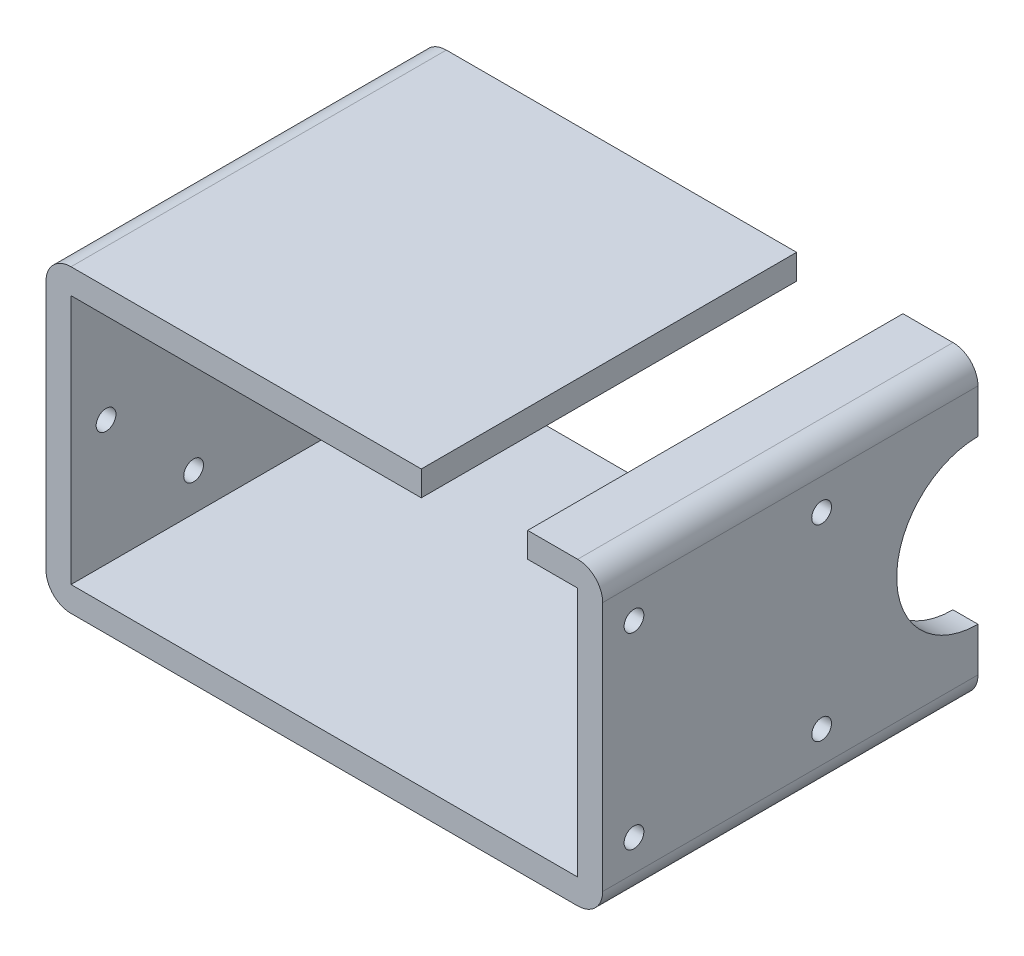
ISO-10303-21;
HEADER;
FILE_DESCRIPTION(('STEP AP214'),'2;1');
FILE_NAME('part.step','',(''),(''),'','','');
FILE_SCHEMA(('AUTOMOTIVE_DESIGN { 1 0 10303 214 1 1 1 1 }'));
ENDSEC;
DATA;
#1=APPLICATION_CONTEXT('core data for automotive mechanical design processes');
#2=APPLICATION_PROTOCOL_DEFINITION('international standard','automotive_design',2000,#1);
#3=PRODUCT_CONTEXT('',#1,'mechanical');
#4=PRODUCT('Part','Part','',(#3));
#5=PRODUCT_RELATED_PRODUCT_CATEGORY('part','',(#4));
#6=PRODUCT_DEFINITION_FORMATION('','',#4);
#7=PRODUCT_DEFINITION_CONTEXT('part definition',#1,'design');
#8=PRODUCT_DEFINITION('design','',#6,#7);
#9=PRODUCT_DEFINITION_SHAPE('','',#8);
#10=(LENGTH_UNIT() NAMED_UNIT(*) SI_UNIT(.MILLI.,.METRE.));
#11=(NAMED_UNIT(*) PLANE_ANGLE_UNIT() SI_UNIT($,.RADIAN.));
#12=(NAMED_UNIT(*) SI_UNIT($,.STERADIAN.) SOLID_ANGLE_UNIT());
#13=UNCERTAINTY_MEASURE_WITH_UNIT(LENGTH_MEASURE(1.E-05),#10,'distance_accuracy_value','');
#14=(GEOMETRIC_REPRESENTATION_CONTEXT(3) GLOBAL_UNCERTAINTY_ASSIGNED_CONTEXT((#13)) GLOBAL_UNIT_ASSIGNED_CONTEXT((#10,
#11,#12)) REPRESENTATION_CONTEXT('',''));
#15=CARTESIAN_POINT('',(0.,0.,0.));
#16=DIRECTION('',(0.,0.,1.));
#17=DIRECTION('',(1.,0.,0.));
#18=AXIS2_PLACEMENT_3D('',#15,#16,#17);
#19=CARTESIAN_POINT('',(42.5,22.,-30.));
#20=DIRECTION('',(0.,1.,0.));
#21=DIRECTION('',(0.,0.,1.));
#22=AXIS2_PLACEMENT_3D('',#19,#20,#21);
#23=PLANE('',#22);
#24=DIRECTION('',(0.,0.,1.));
#25=VECTOR('',#24,1.);
#26=CARTESIAN_POINT('',(36.5,22.,-30.));
#27=LINE('',#26,#25);
#28=CARTESIAN_POINT('',(36.5,22.,-30.));
#29=VERTEX_POINT('',#28);
#30=CARTESIAN_POINT('',(36.5,22.,0.));
#31=VERTEX_POINT('',#30);
#32=EDGE_CURVE('E181',#29,#31,#27,.T.);
#33=ORIENTED_EDGE('',*,*,#32,.T.);
#34=DIRECTION('',(-1.,0.,0.));
#35=VECTOR('',#34,1.);
#36=CARTESIAN_POINT('',(42.5,22.,0.));
#37=LINE('',#36,#35);
#38=CARTESIAN_POINT('',(40.5,22.,0.));
#39=VERTEX_POINT('',#38);
#40=EDGE_CURVE('E183',#39,#31,#37,.T.);
#41=ORIENTED_EDGE('',*,*,#40,.F.);
#42=DIRECTION('',(0.,0.,1.));
#43=VECTOR('',#42,1.);
#44=CARTESIAN_POINT('',(40.5,22.,-30.));
#45=LINE('',#44,#43);
#46=CARTESIAN_POINT('',(40.5,22.,-30.));
#47=VERTEX_POINT('',#46);
#48=EDGE_CURVE('E243',#39,#47,#45,.F.);
#49=ORIENTED_EDGE('',*,*,#48,.T.);
#50=DIRECTION('',(-1.,0.,0.));
#51=VECTOR('',#50,1.);
#52=CARTESIAN_POINT('',(42.5,22.,-30.));
#53=LINE('',#52,#51);
#54=EDGE_CURVE('E186',#47,#29,#53,.T.);
#55=ORIENTED_EDGE('',*,*,#54,.T.);
#56=EDGE_LOOP('',(#33,#41,#49,#55));
#57=FACE_BOUND('',#56,.T.);
#58=ADVANCED_FACE('F17',(#57),#23,.T.);
#59=CARTESIAN_POINT('',(40.5,20.,-30.));
#60=DIRECTION('',(0.,1.,0.));
#61=DIRECTION('',(0.,0.,1.));
#62=AXIS2_PLACEMENT_3D('',#59,#60,#61);
#63=PLANE('',#62);
#64=DIRECTION('',(-1.,0.,0.));
#65=VECTOR('',#64,1.);
#66=CARTESIAN_POINT('',(40.5,20.,0.));
#67=LINE('',#66,#65);
#68=CARTESIAN_POINT('',(40.5,20.,0.));
#69=VERTEX_POINT('',#68);
#70=CARTESIAN_POINT('',(36.5,20.,0.));
#71=VERTEX_POINT('',#70);
#72=EDGE_CURVE('E227',#69,#71,#67,.T.);
#73=ORIENTED_EDGE('',*,*,#72,.T.);
#74=DIRECTION('',(0.,0.,1.));
#75=VECTOR('',#74,1.);
#76=CARTESIAN_POINT('',(36.5,20.,-30.));
#77=LINE('',#76,#75);
#78=CARTESIAN_POINT('',(36.5,20.,-30.));
#79=VERTEX_POINT('',#78);
#80=EDGE_CURVE('E33',#79,#71,#77,.T.);
#81=ORIENTED_EDGE('',*,*,#80,.F.);
#82=DIRECTION('',(-1.,0.,0.));
#83=VECTOR('',#82,1.);
#84=CARTESIAN_POINT('',(40.5,20.,-30.));
#85=LINE('',#84,#83);
#86=CARTESIAN_POINT('',(40.5,20.,-30.));
#87=VERTEX_POINT('',#86);
#88=EDGE_CURVE('E287',#87,#79,#85,.T.);
#89=ORIENTED_EDGE('',*,*,#88,.F.);
#90=DIRECTION('',(0.,0.,1.));
#91=VECTOR('',#90,1.);
#92=CARTESIAN_POINT('',(40.5,20.,-30.));
#93=LINE('',#92,#91);
#94=EDGE_CURVE('E229',#87,#69,#93,.T.);
#95=ORIENTED_EDGE('',*,*,#94,.T.);
#96=EDGE_LOOP('',(#73,#81,#89,#95));
#97=FACE_BOUND('',#96,.T.);
#98=ADVANCED_FACE('F633',(#97),#63,.F.);
#99=CARTESIAN_POINT('',(28.,22.,0.));
#100=VERTEX_POINT('',#99);
#101=CARTESIAN_POINT('',(0.,22.,0.));
#102=VERTEX_POINT('',#101);
#103=EDGE_CURVE('E204',#100,#102,#37,.T.);
#104=ORIENTED_EDGE('',*,*,#103,.F.);
#105=DIRECTION('',(0.,0.,-1.));
#106=VECTOR('',#105,1.);
#107=CARTESIAN_POINT('',(28.,22.,-18.5));
#108=LINE('',#107,#106);
#109=CARTESIAN_POINT('',(28.,22.,-30.));
#110=VERTEX_POINT('',#109);
#111=EDGE_CURVE('E190',#100,#110,#108,.T.);
#112=ORIENTED_EDGE('',*,*,#111,.T.);
#113=CARTESIAN_POINT('',(0.,22.,-30.));
#114=VERTEX_POINT('',#113);
#115=EDGE_CURVE('E266',#110,#114,#53,.T.);
#116=ORIENTED_EDGE('',*,*,#115,.T.);
#117=DIRECTION('',(0.,0.,1.));
#118=VECTOR('',#117,1.);
#119=CARTESIAN_POINT('',(0.,22.,-30.));
#120=LINE('',#119,#118);
#121=EDGE_CURVE('E434',#114,#102,#120,.T.);
#122=ORIENTED_EDGE('',*,*,#121,.T.);
#123=EDGE_LOOP('',(#104,#112,#116,#122));
#124=FACE_BOUND('',#123,.T.);
#125=ADVANCED_FACE('F635',(#124),#23,.T.);
#126=CARTESIAN_POINT('',(0.,0.,-30.));
#127=DIRECTION('',(0.,0.,1.));
#128=DIRECTION('',(1.,0.,0.));
#129=AXIS2_PLACEMENT_3D('',#126,#127,#128);
#130=PLANE('',#129);
#131=DIRECTION('',(0.,1.,0.));
#132=VECTOR('',#131,1.);
#133=CARTESIAN_POINT('',(28.,-2.2,-30.));
#134=LINE('',#133,#132);
#135=CARTESIAN_POINT('',(28.,-2.,-30.));
#136=VERTEX_POINT('',#135);
#137=CARTESIAN_POINT('',(28.,0.,-30.));
#138=VERTEX_POINT('',#137);
#139=EDGE_CURVE('E409',#136,#138,#134,.T.);
#140=ORIENTED_EDGE('',*,*,#139,.F.);
#141=DIRECTION('',(1.,0.,0.));
#142=VECTOR('',#141,1.);
#143=CARTESIAN_POINT('',(-2.,-2.,-30.));
#144=LINE('',#143,#142);
#145=CARTESIAN_POINT('',(0.,-2.,-30.));
#146=VERTEX_POINT('',#145);
#147=EDGE_CURVE('E250',#146,#136,#144,.T.);
#148=ORIENTED_EDGE('',*,*,#147,.F.);
#149=CARTESIAN_POINT('',(0.,0.,-30.));
#150=DIRECTION('',(0.,0.,1.));
#151=DIRECTION('',(1.,0.,0.));
#152=AXIS2_PLACEMENT_3D('',#149,#150,#151);
#153=CIRCLE('',#152,2.);
#154=CARTESIAN_POINT('',(-2.,0.,-30.));
#155=VERTEX_POINT('',#154);
#156=EDGE_CURVE('E273',#146,#155,#153,.F.);
#157=ORIENTED_EDGE('',*,*,#156,.T.);
#158=DIRECTION('',(0.,-1.,0.));
#159=VECTOR('',#158,1.);
#160=CARTESIAN_POINT('',(-2.,22.,-30.));
#161=LINE('',#160,#159);
#162=CARTESIAN_POINT('',(-2.,3.5,-30.));
#163=VERTEX_POINT('',#162);
#164=EDGE_CURVE('E222',#163,#155,#161,.T.);
#165=ORIENTED_EDGE('',*,*,#164,.F.);
#166=DIRECTION('',(1.,0.,0.));
#167=VECTOR('',#166,1.);
#168=CARTESIAN_POINT('',(-2.,3.5,-30.));
#169=LINE('',#168,#167);
#170=CARTESIAN_POINT('',(0.,3.5,-30.));
#171=VERTEX_POINT('',#170);
#172=EDGE_CURVE('E353',#171,#163,#169,.F.);
#173=ORIENTED_EDGE('',*,*,#172,.F.);
#174=DIRECTION('',(0.,-1.,0.));
#175=VECTOR('',#174,1.);
#176=CARTESIAN_POINT('',(0.,20.,-30.));
#177=LINE('',#176,#175);
#178=CARTESIAN_POINT('',(0.,0.,-30.));
#179=VERTEX_POINT('',#178);
#180=EDGE_CURVE('E284',#171,#179,#177,.T.);
#181=ORIENTED_EDGE('',*,*,#180,.T.);
#182=DIRECTION('',(1.,0.,0.));
#183=VECTOR('',#182,1.);
#184=CARTESIAN_POINT('',(0.,0.,-30.));
#185=LINE('',#184,#183);
#186=EDGE_CURVE('E239',#179,#138,#185,.T.);
#187=ORIENTED_EDGE('',*,*,#186,.T.);
#188=EDGE_LOOP('',(#140,#148,#157,#165,#173,#181,#187));
#189=FACE_BOUND('',#188,.T.);
#190=ADVANCED_FACE('F405',(#189),#130,.F.);
#191=CARTESIAN_POINT('',(-2.,-2.,-30.));
#192=DIRECTION('',(0.,-1.,0.));
#193=DIRECTION('',(0.,0.,-1.));
#194=AXIS2_PLACEMENT_3D('',#191,#192,#193);
#195=PLANE('',#194);
#196=ORIENTED_EDGE('',*,*,#147,.T.);
#197=DIRECTION('',(0.,0.,1.));
#198=VECTOR('',#197,1.);
#199=CARTESIAN_POINT('',(28.,-2.,-30.));
#200=LINE('',#199,#198);
#201=CARTESIAN_POINT('',(28.,-2.,-18.5));
#202=VERTEX_POINT('',#201);
#203=EDGE_CURVE('E547',#136,#202,#200,.T.);
#204=ORIENTED_EDGE('',*,*,#203,.T.);
#205=DIRECTION('',(1.,0.,0.));
#206=VECTOR('',#205,1.);
#207=CARTESIAN_POINT('',(28.,-2.,-18.5));
#208=LINE('',#207,#206);
#209=CARTESIAN_POINT('',(36.5,-2.,-18.5));
#210=VERTEX_POINT('',#209);
#211=EDGE_CURVE('E550',#202,#210,#208,.T.);
#212=ORIENTED_EDGE('',*,*,#211,.T.);
#213=DIRECTION('',(0.,0.,-1.));
#214=VECTOR('',#213,1.);
#215=CARTESIAN_POINT('',(36.5,-2.,-18.5));
#216=LINE('',#215,#214);
#217=CARTESIAN_POINT('',(36.5,-2.,-30.));
#218=VERTEX_POINT('',#217);
#219=EDGE_CURVE('E544',#210,#218,#216,.T.);
#220=ORIENTED_EDGE('',*,*,#219,.T.);
#221=CARTESIAN_POINT('',(40.5,-2.,-30.));
#222=VERTEX_POINT('',#221);
#223=EDGE_CURVE('E332',#218,#222,#144,.T.);
#224=ORIENTED_EDGE('',*,*,#223,.T.);
#225=DIRECTION('',(0.,0.,1.));
#226=VECTOR('',#225,1.);
#227=CARTESIAN_POINT('',(40.5,-2.,-30.));
#228=LINE('',#227,#226);
#229=CARTESIAN_POINT('',(40.5,-2.,0.));
#230=VERTEX_POINT('',#229);
#231=EDGE_CURVE('E327',#222,#230,#228,.T.);
#232=ORIENTED_EDGE('',*,*,#231,.T.);
#233=DIRECTION('',(1.,0.,0.));
#234=VECTOR('',#233,1.);
#235=CARTESIAN_POINT('',(-2.,-2.,0.));
#236=LINE('',#235,#234);
#237=CARTESIAN_POINT('',(0.,-2.,0.));
#238=VERTEX_POINT('',#237);
#239=EDGE_CURVE('E303',#238,#230,#236,.T.);
#240=ORIENTED_EDGE('',*,*,#239,.F.);
#241=DIRECTION('',(0.,0.,1.));
#242=VECTOR('',#241,1.);
#243=CARTESIAN_POINT('',(0.,-2.,-30.));
#244=LINE('',#243,#242);
#245=EDGE_CURVE('E267',#238,#146,#244,.F.);
#246=ORIENTED_EDGE('',*,*,#245,.T.);
#247=EDGE_LOOP('',(#196,#204,#212,#220,#224,#232,#240,#246));
#248=FACE_BOUND('',#247,.T.);
#249=ADVANCED_FACE('F399',(#248),#195,.T.);
#250=CARTESIAN_POINT('',(0.,0.,-30.));
#251=DIRECTION('',(0.,-1.,0.));
#252=DIRECTION('',(0.,0.,-1.));
#253=AXIS2_PLACEMENT_3D('',#250,#251,#252);
#254=PLANE('',#253);
#255=DIRECTION('',(0.,0.,1.));
#256=VECTOR('',#255,1.);
#257=CARTESIAN_POINT('',(28.,0.,-30.));
#258=LINE('',#257,#256);
#259=CARTESIAN_POINT('',(28.,0.,-18.5));
#260=VERTEX_POINT('',#259);
#261=EDGE_CURVE('E524',#138,#260,#258,.T.);
#262=ORIENTED_EDGE('',*,*,#261,.F.);
#263=ORIENTED_EDGE('',*,*,#186,.F.);
#264=DIRECTION('',(0.,0.,1.));
#265=VECTOR('',#264,1.);
#266=CARTESIAN_POINT('',(0.,0.,-30.));
#267=LINE('',#266,#265);
#268=CARTESIAN_POINT('',(0.,0.,0.));
#269=VERTEX_POINT('',#268);
#270=EDGE_CURVE('E236',#179,#269,#267,.T.);
#271=ORIENTED_EDGE('',*,*,#270,.T.);
#272=DIRECTION('',(1.,0.,0.));
#273=VECTOR('',#272,1.);
#274=CARTESIAN_POINT('',(0.,0.,0.));
#275=LINE('',#274,#273);
#276=CARTESIAN_POINT('',(40.5,0.,0.));
#277=VERTEX_POINT('',#276);
#278=EDGE_CURVE('E218',#269,#277,#275,.T.);
#279=ORIENTED_EDGE('',*,*,#278,.T.);
#280=DIRECTION('',(0.,0.,1.));
#281=VECTOR('',#280,1.);
#282=CARTESIAN_POINT('',(40.5,0.,-30.));
#283=LINE('',#282,#281);
#284=CARTESIAN_POINT('',(40.5,0.,-30.));
#285=VERTEX_POINT('',#284);
#286=EDGE_CURVE('E233',#285,#277,#283,.T.);
#287=ORIENTED_EDGE('',*,*,#286,.F.);
#288=CARTESIAN_POINT('',(36.5,0.,-30.));
#289=VERTEX_POINT('',#288);
#290=EDGE_CURVE('E592',#289,#285,#185,.T.);
#291=ORIENTED_EDGE('',*,*,#290,.F.);
#292=DIRECTION('',(0.,0.,-1.));
#293=VECTOR('',#292,1.);
#294=CARTESIAN_POINT('',(36.5,0.,-18.5));
#295=LINE('',#294,#293);
#296=CARTESIAN_POINT('',(36.5,0.,-18.5));
#297=VERTEX_POINT('',#296);
#298=EDGE_CURVE('E542',#297,#289,#295,.T.);
#299=ORIENTED_EDGE('',*,*,#298,.F.);
#300=DIRECTION('',(1.,0.,0.));
#301=VECTOR('',#300,1.);
#302=CARTESIAN_POINT('',(28.,0.,-18.5));
#303=LINE('',#302,#301);
#304=EDGE_CURVE('E41',#260,#297,#303,.T.);
#305=ORIENTED_EDGE('',*,*,#304,.F.);
#306=EDGE_LOOP('',(#262,#263,#271,#279,#287,#291,#299,#305));
#307=FACE_BOUND('',#306,.T.);
#308=ADVANCED_FACE('F590',(#307),#254,.F.);
#309=DIRECTION('',(0.,-1.,0.));
#310=VECTOR('',#309,1.);
#311=CARTESIAN_POINT('',(36.5,22.,-30.));
#312=LINE('',#311,#310);
#313=EDGE_CURVE('E189',#29,#79,#312,.T.);
#314=ORIENTED_EDGE('',*,*,#313,.F.);
#315=ORIENTED_EDGE('',*,*,#54,.F.);
#316=CARTESIAN_POINT('',(40.5,20.,-30.));
#317=DIRECTION('',(0.,0.,1.));
#318=DIRECTION('',(1.,0.,0.));
#319=AXIS2_PLACEMENT_3D('',#316,#317,#318);
#320=CIRCLE('',#319,2.);
#321=CARTESIAN_POINT('',(42.5,20.,-30.));
#322=VERTEX_POINT('',#321);
#323=EDGE_CURVE('E384',#47,#322,#320,.F.);
#324=ORIENTED_EDGE('',*,*,#323,.T.);
#325=DIRECTION('',(0.,1.,0.));
#326=VECTOR('',#325,1.);
#327=CARTESIAN_POINT('',(42.5,-2.,-30.));
#328=LINE('',#327,#326);
#329=CARTESIAN_POINT('',(42.5,16.5,-30.));
#330=VERTEX_POINT('',#329);
#331=EDGE_CURVE('E244',#330,#322,#328,.T.);
#332=ORIENTED_EDGE('',*,*,#331,.F.);
#333=DIRECTION('',(1.,0.,0.));
#334=VECTOR('',#333,1.);
#335=CARTESIAN_POINT('',(40.5,16.5,-30.));
#336=LINE('',#335,#334);
#337=CARTESIAN_POINT('',(40.5,16.5,-30.));
#338=VERTEX_POINT('',#337);
#339=EDGE_CURVE('E343',#330,#338,#336,.F.);
#340=ORIENTED_EDGE('',*,*,#339,.T.);
#341=DIRECTION('',(0.,1.,0.));
#342=VECTOR('',#341,1.);
#343=CARTESIAN_POINT('',(40.5,0.,-30.));
#344=LINE('',#343,#342);
#345=EDGE_CURVE('E292',#338,#87,#344,.T.);
#346=ORIENTED_EDGE('',*,*,#345,.T.);
#347=ORIENTED_EDGE('',*,*,#88,.T.);
#348=EDGE_LOOP('',(#314,#315,#324,#332,#340,#346,#347));
#349=FACE_BOUND('',#348,.T.);
#350=ADVANCED_FACE('F650',(#349),#130,.F.);
#351=DIRECTION('',(0.,0.,-1.));
#352=VECTOR('',#351,1.);
#353=CARTESIAN_POINT('',(28.,20.,-18.5));
#354=LINE('',#353,#352);
#355=CARTESIAN_POINT('',(28.,20.,0.));
#356=VERTEX_POINT('',#355);
#357=CARTESIAN_POINT('',(28.,20.,-30.));
#358=VERTEX_POINT('',#357);
#359=EDGE_CURVE('E521',#356,#358,#354,.T.);
#360=ORIENTED_EDGE('',*,*,#359,.F.);
#361=CARTESIAN_POINT('',(0.,20.,0.));
#362=VERTEX_POINT('',#361);
#363=EDGE_CURVE('E211',#356,#362,#67,.T.);
#364=ORIENTED_EDGE('',*,*,#363,.T.);
#365=DIRECTION('',(0.,0.,1.));
#366=VECTOR('',#365,1.);
#367=CARTESIAN_POINT('',(0.,20.,-30.));
#368=LINE('',#367,#366);
#369=CARTESIAN_POINT('',(0.,20.,-30.));
#370=VERTEX_POINT('',#369);
#371=EDGE_CURVE('E232',#370,#362,#368,.T.);
#372=ORIENTED_EDGE('',*,*,#371,.F.);
#373=EDGE_CURVE('E293',#358,#370,#85,.T.);
#374=ORIENTED_EDGE('',*,*,#373,.F.);
#375=EDGE_LOOP('',(#360,#364,#372,#374));
#376=FACE_BOUND('',#375,.T.);
#377=ADVANCED_FACE('F641',(#376),#63,.F.);
#378=CARTESIAN_POINT('',(40.5,0.,-30.));
#379=DIRECTION('',(1.,0.,0.));
#380=DIRECTION('',(0.,0.,-1.));
#381=AXIS2_PLACEMENT_3D('',#378,#379,#380);
#382=PLANE('',#381);
#383=CARTESIAN_POINT('',(40.5,2.5,-2.5));
#384=DIRECTION('',(-1.,0.,0.));
#385=DIRECTION('',(0.,-1.,0.));
#386=AXIS2_PLACEMENT_3D('',#383,#384,#385);
#387=CIRCLE('',#386,0.79);
#388=CARTESIAN_POINT('',(40.5,1.71,-2.5));
#389=VERTEX_POINT('',#388);
#390=EDGE_CURVE('E468',#389,#389,#387,.T.);
#391=ORIENTED_EDGE('',*,*,#390,.F.);
#392=EDGE_LOOP('',(#391));
#393=FACE_BOUND('',#392,.T.);
#394=CARTESIAN_POINT('',(40.5,17.5,-17.5));
#395=DIRECTION('',(-1.,0.,0.));
#396=DIRECTION('',(0.,-1.,0.));
#397=AXIS2_PLACEMENT_3D('',#394,#395,#396);
#398=CIRCLE('',#397,0.79);
#399=CARTESIAN_POINT('',(40.5,16.71,-17.5));
#400=VERTEX_POINT('',#399);
#401=EDGE_CURVE('E459',#400,#400,#398,.T.);
#402=ORIENTED_EDGE('',*,*,#401,.F.);
#403=EDGE_LOOP('',(#402));
#404=FACE_BOUND('',#403,.T.);
#405=ORIENTED_EDGE('',*,*,#345,.F.);
#406=CARTESIAN_POINT('',(40.5,10.,-30.));
#407=DIRECTION('',(1.,0.,0.));
#408=DIRECTION('',(0.,-1.,0.));
#409=AXIS2_PLACEMENT_3D('',#406,#407,#408);
#410=CIRCLE('',#409,6.5);
#411=CARTESIAN_POINT('',(40.5,3.5,-30.));
#412=VERTEX_POINT('',#411);
#413=EDGE_CURVE('E345',#338,#412,#410,.T.);
#414=ORIENTED_EDGE('',*,*,#413,.T.);
#415=EDGE_CURVE('E251',#285,#412,#344,.T.);
#416=ORIENTED_EDGE('',*,*,#415,.F.);
#417=ORIENTED_EDGE('',*,*,#286,.T.);
#418=DIRECTION('',(0.,1.,0.));
#419=VECTOR('',#418,1.);
#420=CARTESIAN_POINT('',(40.5,0.,0.));
#421=LINE('',#420,#419);
#422=EDGE_CURVE('E223',#277,#69,#421,.T.);
#423=ORIENTED_EDGE('',*,*,#422,.T.);
#424=ORIENTED_EDGE('',*,*,#94,.F.);
#425=EDGE_LOOP('',(#405,#414,#416,#417,#423,#424));
#426=FACE_BOUND('',#425,.T.);
#427=CARTESIAN_POINT('',(40.5,2.5,-17.5));
#428=DIRECTION('',(-1.,0.,0.));
#429=DIRECTION('',(0.,-1.,0.));
#430=AXIS2_PLACEMENT_3D('',#427,#428,#429);
#431=CIRCLE('',#430,0.79);
#432=CARTESIAN_POINT('',(40.5,1.71,-17.5));
#433=VERTEX_POINT('',#432);
#434=EDGE_CURVE('E460',#433,#433,#431,.T.);
#435=ORIENTED_EDGE('',*,*,#434,.F.);
#436=EDGE_LOOP('',(#435));
#437=FACE_BOUND('',#436,.T.);
#438=CARTESIAN_POINT('',(40.5,17.5,-2.5));
#439=DIRECTION('',(-1.,0.,0.));
#440=DIRECTION('',(0.,-1.,0.));
#441=AXIS2_PLACEMENT_3D('',#438,#439,#440);
#442=CIRCLE('',#441,0.79);
#443=CARTESIAN_POINT('',(40.5,16.71,-2.5));
#444=VERTEX_POINT('',#443);
#445=EDGE_CURVE('E476',#444,#444,#442,.T.);
#446=ORIENTED_EDGE('',*,*,#445,.F.);
#447=EDGE_LOOP('',(#446));
#448=FACE_BOUND('',#447,.T.);
#449=ADVANCED_FACE('F677',(#393,#404,#426,#437,#448),#382,.F.);
#450=CARTESIAN_POINT('',(42.5,-2.,-30.));
#451=DIRECTION('',(1.,0.,0.));
#452=DIRECTION('',(0.,0.,-1.));
#453=AXIS2_PLACEMENT_3D('',#450,#451,#452);
#454=PLANE('',#453);
#455=CARTESIAN_POINT('',(42.5,2.5,-2.5));
#456=DIRECTION('',(-1.,0.,0.));
#457=DIRECTION('',(0.,-1.,0.));
#458=AXIS2_PLACEMENT_3D('',#455,#456,#457);
#459=CIRCLE('',#458,0.79);
#460=CARTESIAN_POINT('',(42.5,1.71,-2.5));
#461=VERTEX_POINT('',#460);
#462=EDGE_CURVE('E472',#461,#461,#459,.T.);
#463=ORIENTED_EDGE('',*,*,#462,.T.);
#464=EDGE_LOOP('',(#463));
#465=FACE_BOUND('',#464,.T.);
#466=CARTESIAN_POINT('',(42.5,17.5,-17.5));
#467=DIRECTION('',(-1.,0.,0.));
#468=DIRECTION('',(0.,-1.,0.));
#469=AXIS2_PLACEMENT_3D('',#466,#467,#468);
#470=CIRCLE('',#469,0.79);
#471=CARTESIAN_POINT('',(42.5,16.71,-17.5));
#472=VERTEX_POINT('',#471);
#473=EDGE_CURVE('E455',#472,#472,#470,.T.);
#474=ORIENTED_EDGE('',*,*,#473,.T.);
#475=EDGE_LOOP('',(#474));
#476=FACE_BOUND('',#475,.T.);
#477=DIRECTION('',(0.,1.,0.));
#478=VECTOR('',#477,1.);
#479=CARTESIAN_POINT('',(42.5,-2.,0.));
#480=LINE('',#479,#478);
#481=CARTESIAN_POINT('',(42.5,0.,0.));
#482=VERTEX_POINT('',#481);
#483=CARTESIAN_POINT('',(42.5,20.,0.));
#484=VERTEX_POINT('',#483);
#485=EDGE_CURVE('E214',#482,#484,#480,.T.);
#486=ORIENTED_EDGE('',*,*,#485,.F.);
#487=DIRECTION('',(0.,0.,1.));
#488=VECTOR('',#487,1.);
#489=CARTESIAN_POINT('',(42.5,0.,-30.));
#490=LINE('',#489,#488);
#491=CARTESIAN_POINT('',(42.5,0.,-30.));
#492=VERTEX_POINT('',#491);
#493=EDGE_CURVE('E197',#482,#492,#490,.F.);
#494=ORIENTED_EDGE('',*,*,#493,.T.);
#495=CARTESIAN_POINT('',(42.5,3.5,-30.));
#496=VERTEX_POINT('',#495);
#497=EDGE_CURVE('E249',#492,#496,#328,.T.);
#498=ORIENTED_EDGE('',*,*,#497,.T.);
#499=CARTESIAN_POINT('',(42.5,10.,-30.));
#500=DIRECTION('',(1.,0.,0.));
#501=DIRECTION('',(0.,-1.,0.));
#502=AXIS2_PLACEMENT_3D('',#499,#500,#501);
#503=CIRCLE('',#502,6.5);
#504=EDGE_CURVE('E337',#330,#496,#503,.T.);
#505=ORIENTED_EDGE('',*,*,#504,.F.);
#506=ORIENTED_EDGE('',*,*,#331,.T.);
#507=DIRECTION('',(0.,0.,1.));
#508=VECTOR('',#507,1.);
#509=CARTESIAN_POINT('',(42.5,20.,-30.));
#510=LINE('',#509,#508);
#511=EDGE_CURVE('E276',#322,#484,#510,.T.);
#512=ORIENTED_EDGE('',*,*,#511,.T.);
#513=EDGE_LOOP('',(#486,#494,#498,#505,#506,#512));
#514=FACE_BOUND('',#513,.T.);
#515=CARTESIAN_POINT('',(42.5,2.5,-17.5));
#516=DIRECTION('',(-1.,0.,0.));
#517=DIRECTION('',(0.,-1.,0.));
#518=AXIS2_PLACEMENT_3D('',#515,#516,#517);
#519=CIRCLE('',#518,0.79);
#520=CARTESIAN_POINT('',(42.5,1.71,-17.5));
#521=VERTEX_POINT('',#520);
#522=EDGE_CURVE('E464',#521,#521,#519,.T.);
#523=ORIENTED_EDGE('',*,*,#522,.T.);
#524=EDGE_LOOP('',(#523));
#525=FACE_BOUND('',#524,.T.);
#526=CARTESIAN_POINT('',(42.5,17.5,-2.5));
#527=DIRECTION('',(-1.,0.,0.));
#528=DIRECTION('',(0.,-1.,0.));
#529=AXIS2_PLACEMENT_3D('',#526,#527,#528);
#530=CIRCLE('',#529,0.79);
#531=CARTESIAN_POINT('',(42.5,16.71,-2.5));
#532=VERTEX_POINT('',#531);
#533=EDGE_CURVE('E480',#532,#532,#530,.T.);
#534=ORIENTED_EDGE('',*,*,#533,.T.);
#535=EDGE_LOOP('',(#534));
#536=FACE_BOUND('',#535,.T.);
#537=ADVANCED_FACE('F318',(#465,#476,#514,#525,#536),#454,.T.);
#538=ORIENTED_EDGE('',*,*,#223,.F.);
#539=DIRECTION('',(0.,1.,0.));
#540=VECTOR('',#539,1.);
#541=CARTESIAN_POINT('',(36.5,-2.2,-30.));
#542=LINE('',#541,#540);
#543=EDGE_CURVE('E543',#218,#289,#542,.T.);
#544=ORIENTED_EDGE('',*,*,#543,.T.);
#545=ORIENTED_EDGE('',*,*,#290,.T.);
#546=ORIENTED_EDGE('',*,*,#415,.T.);
#547=DIRECTION('',(1.,0.,0.));
#548=VECTOR('',#547,1.);
#549=CARTESIAN_POINT('',(40.5,3.5,-30.));
#550=LINE('',#549,#548);
#551=EDGE_CURVE('E304',#412,#496,#550,.T.);
#552=ORIENTED_EDGE('',*,*,#551,.T.);
#553=ORIENTED_EDGE('',*,*,#497,.F.);
#554=CARTESIAN_POINT('',(40.5,0.,-30.));
#555=DIRECTION('',(0.,0.,1.));
#556=DIRECTION('',(1.,0.,0.));
#557=AXIS2_PLACEMENT_3D('',#554,#555,#556);
#558=CIRCLE('',#557,2.);
#559=EDGE_CURVE('E269',#492,#222,#558,.F.);
#560=ORIENTED_EDGE('',*,*,#559,.T.);
#561=EDGE_LOOP('',(#538,#544,#545,#546,#552,#553,#560));
#562=FACE_BOUND('',#561,.T.);
#563=ADVANCED_FACE('F330',(#562),#130,.F.);
#564=ORIENTED_EDGE('',*,*,#115,.F.);
#565=DIRECTION('',(0.,-1.,0.));
#566=VECTOR('',#565,1.);
#567=CARTESIAN_POINT('',(28.,22.,-30.));
#568=LINE('',#567,#566);
#569=EDGE_CURVE('E508',#110,#358,#568,.T.);
#570=ORIENTED_EDGE('',*,*,#569,.T.);
#571=ORIENTED_EDGE('',*,*,#373,.T.);
#572=CARTESIAN_POINT('',(0.,16.5,-30.));
#573=VERTEX_POINT('',#572);
#574=EDGE_CURVE('E602',#370,#573,#177,.T.);
#575=ORIENTED_EDGE('',*,*,#574,.T.);
#576=DIRECTION('',(1.,0.,0.));
#577=VECTOR('',#576,1.);
#578=CARTESIAN_POINT('',(-2.,16.5,-30.));
#579=LINE('',#578,#577);
#580=CARTESIAN_POINT('',(-2.,16.5,-30.));
#581=VERTEX_POINT('',#580);
#582=EDGE_CURVE('E346',#581,#573,#579,.T.);
#583=ORIENTED_EDGE('',*,*,#582,.F.);
#584=CARTESIAN_POINT('',(-2.,20.,-30.));
#585=VERTEX_POINT('',#584);
#586=EDGE_CURVE('E371',#585,#581,#161,.T.);
#587=ORIENTED_EDGE('',*,*,#586,.F.);
#588=CARTESIAN_POINT('',(0.,20.,-30.));
#589=DIRECTION('',(0.,0.,1.));
#590=DIRECTION('',(1.,0.,0.));
#591=AXIS2_PLACEMENT_3D('',#588,#589,#590);
#592=CIRCLE('',#591,2.);
#593=EDGE_CURVE('E387',#585,#114,#592,.F.);
#594=ORIENTED_EDGE('',*,*,#593,.T.);
#595=EDGE_LOOP('',(#564,#570,#571,#575,#583,#587,#594));
#596=FACE_BOUND('',#595,.T.);
#597=ADVANCED_FACE('F656',(#596),#130,.F.);
#598=CARTESIAN_POINT('',(0.,20.,-30.));
#599=DIRECTION('',(-1.,0.,0.));
#600=DIRECTION('',(0.,0.,1.));
#601=AXIS2_PLACEMENT_3D('',#598,#599,#600);
#602=PLANE('',#601);
#603=CARTESIAN_POINT('',(0.,17.,-9.8));
#604=DIRECTION('',(-1.,0.,0.));
#605=DIRECTION('',(0.,1.,0.));
#606=AXIS2_PLACEMENT_3D('',#603,#604,#605);
#607=CIRCLE('',#606,0.79);
#608=CARTESIAN_POINT('',(0.,17.79,-9.8));
#609=VERTEX_POINT('',#608);
#610=EDGE_CURVE('E500',#609,#609,#607,.T.);
#611=ORIENTED_EDGE('',*,*,#610,.T.);
#612=EDGE_LOOP('',(#611));
#613=FACE_BOUND('',#612,.T.);
#614=CARTESIAN_POINT('',(0.,3.,-9.8));
#615=DIRECTION('',(-1.,0.,0.));
#616=DIRECTION('',(0.,1.,0.));
#617=AXIS2_PLACEMENT_3D('',#614,#615,#616);
#618=CIRCLE('',#617,0.79);
#619=CARTESIAN_POINT('',(0.,3.79,-9.8));
#620=VERTEX_POINT('',#619);
#621=EDGE_CURVE('E492',#620,#620,#618,.T.);
#622=ORIENTED_EDGE('',*,*,#621,.T.);
#623=EDGE_LOOP('',(#622));
#624=FACE_BOUND('',#623,.T.);
#625=CARTESIAN_POINT('',(0.,10.,-2.8));
#626=DIRECTION('',(-1.,0.,0.));
#627=DIRECTION('',(0.,1.,0.));
#628=AXIS2_PLACEMENT_3D('',#625,#626,#627);
#629=CIRCLE('',#628,0.79);
#630=CARTESIAN_POINT('',(0.,10.79,-2.8));
#631=VERTEX_POINT('',#630);
#632=EDGE_CURVE('E484',#631,#631,#629,.T.);
#633=ORIENTED_EDGE('',*,*,#632,.T.);
#634=EDGE_LOOP('',(#633));
#635=FACE_BOUND('',#634,.T.);
#636=ORIENTED_EDGE('',*,*,#180,.F.);
#637=CARTESIAN_POINT('',(0.,10.,-30.));
#638=DIRECTION('',(-1.,0.,0.));
#639=DIRECTION('',(0.,-1.,0.));
#640=AXIS2_PLACEMENT_3D('',#637,#638,#639);
#641=CIRCLE('',#640,6.5);
#642=EDGE_CURVE('E442',#171,#573,#641,.T.);
#643=ORIENTED_EDGE('',*,*,#642,.T.);
#644=ORIENTED_EDGE('',*,*,#574,.F.);
#645=ORIENTED_EDGE('',*,*,#371,.T.);
#646=DIRECTION('',(0.,-1.,0.));
#647=VECTOR('',#646,1.);
#648=CARTESIAN_POINT('',(0.,20.,0.));
#649=LINE('',#648,#647);
#650=EDGE_CURVE('E203',#362,#269,#649,.T.);
#651=ORIENTED_EDGE('',*,*,#650,.T.);
#652=ORIENTED_EDGE('',*,*,#270,.F.);
#653=EDGE_LOOP('',(#636,#643,#644,#645,#651,#652));
#654=FACE_BOUND('',#653,.T.);
#655=ADVANCED_FACE('F617',(#613,#624,#635,#654),#602,.F.);
#656=CARTESIAN_POINT('',(-2.,22.,-30.));
#657=DIRECTION('',(-1.,0.,0.));
#658=DIRECTION('',(0.,0.,1.));
#659=AXIS2_PLACEMENT_3D('',#656,#657,#658);
#660=PLANE('',#659);
#661=CARTESIAN_POINT('',(-2.,17.,-9.8));
#662=DIRECTION('',(-1.,0.,0.));
#663=DIRECTION('',(0.,1.,0.));
#664=AXIS2_PLACEMENT_3D('',#661,#662,#663);
#665=CIRCLE('',#664,0.79);
#666=CARTESIAN_POINT('',(-2.,17.79,-9.8));
#667=VERTEX_POINT('',#666);
#668=EDGE_CURVE('E504',#667,#667,#665,.T.);
#669=ORIENTED_EDGE('',*,*,#668,.F.);
#670=EDGE_LOOP('',(#669));
#671=FACE_BOUND('',#670,.T.);
#672=CARTESIAN_POINT('',(-2.,3.,-9.8));
#673=DIRECTION('',(-1.,0.,0.));
#674=DIRECTION('',(0.,1.,0.));
#675=AXIS2_PLACEMENT_3D('',#672,#673,#674);
#676=CIRCLE('',#675,0.79);
#677=CARTESIAN_POINT('',(-2.,3.79,-9.8));
#678=VERTEX_POINT('',#677);
#679=EDGE_CURVE('E496',#678,#678,#676,.T.);
#680=ORIENTED_EDGE('',*,*,#679,.F.);
#681=EDGE_LOOP('',(#680));
#682=FACE_BOUND('',#681,.T.);
#683=CARTESIAN_POINT('',(-2.,10.,-2.8));
#684=DIRECTION('',(-1.,0.,0.));
#685=DIRECTION('',(0.,1.,0.));
#686=AXIS2_PLACEMENT_3D('',#683,#684,#685);
#687=CIRCLE('',#686,0.79);
#688=CARTESIAN_POINT('',(-2.,10.79,-2.8));
#689=VERTEX_POINT('',#688);
#690=EDGE_CURVE('E488',#689,#689,#687,.T.);
#691=ORIENTED_EDGE('',*,*,#690,.F.);
#692=EDGE_LOOP('',(#691));
#693=FACE_BOUND('',#692,.T.);
#694=DIRECTION('',(0.,-1.,0.));
#695=VECTOR('',#694,1.);
#696=CARTESIAN_POINT('',(-2.,22.,0.));
#697=LINE('',#696,#695);
#698=CARTESIAN_POINT('',(-2.,20.,0.));
#699=VERTEX_POINT('',#698);
#700=CARTESIAN_POINT('',(-2.,0.,0.));
#701=VERTEX_POINT('',#700);
#702=EDGE_CURVE('E299',#699,#701,#697,.T.);
#703=ORIENTED_EDGE('',*,*,#702,.F.);
#704=DIRECTION('',(0.,0.,1.));
#705=VECTOR('',#704,1.);
#706=CARTESIAN_POINT('',(-2.,20.,-30.));
#707=LINE('',#706,#705);
#708=EDGE_CURVE('E381',#699,#585,#707,.F.);
#709=ORIENTED_EDGE('',*,*,#708,.T.);
#710=ORIENTED_EDGE('',*,*,#586,.T.);
#711=CARTESIAN_POINT('',(-2.,10.,-30.));
#712=DIRECTION('',(-1.,0.,0.));
#713=DIRECTION('',(0.,-1.,0.));
#714=AXIS2_PLACEMENT_3D('',#711,#712,#713);
#715=CIRCLE('',#714,6.5);
#716=EDGE_CURVE('E441',#163,#581,#715,.T.);
#717=ORIENTED_EDGE('',*,*,#716,.F.);
#718=ORIENTED_EDGE('',*,*,#164,.T.);
#719=DIRECTION('',(0.,0.,1.));
#720=VECTOR('',#719,1.);
#721=CARTESIAN_POINT('',(-2.,0.,-30.));
#722=LINE('',#721,#720);
#723=EDGE_CURVE('E377',#155,#701,#722,.T.);
#724=ORIENTED_EDGE('',*,*,#723,.T.);
#725=EDGE_LOOP('',(#703,#709,#710,#717,#718,#724));
#726=FACE_BOUND('',#725,.T.);
#727=ADVANCED_FACE('F417',(#671,#682,#693,#726),#660,.T.);
#728=CARTESIAN_POINT('',(0.,0.,0.));
#729=DIRECTION('',(0.,0.,1.));
#730=DIRECTION('',(1.,0.,0.));
#731=AXIS2_PLACEMENT_3D('',#728,#729,#730);
#732=PLANE('',#731);
#733=DIRECTION('',(0.,-1.,0.));
#734=VECTOR('',#733,1.);
#735=CARTESIAN_POINT('',(28.,0.,0.));
#736=LINE('',#735,#734);
#737=EDGE_CURVE('E11',#100,#356,#736,.T.);
#738=ORIENTED_EDGE('',*,*,#737,.F.);
#739=ORIENTED_EDGE('',*,*,#103,.T.);
#740=CARTESIAN_POINT('',(0.,20.,0.));
#741=DIRECTION('',(0.,0.,1.));
#742=DIRECTION('',(1.,0.,0.));
#743=AXIS2_PLACEMENT_3D('',#740,#741,#742);
#744=CIRCLE('',#743,2.);
#745=EDGE_CURVE('E375',#102,#699,#744,.T.);
#746=ORIENTED_EDGE('',*,*,#745,.T.);
#747=ORIENTED_EDGE('',*,*,#702,.T.);
#748=CARTESIAN_POINT('',(0.,0.,0.));
#749=DIRECTION('',(0.,0.,1.));
#750=DIRECTION('',(1.,0.,0.));
#751=AXIS2_PLACEMENT_3D('',#748,#749,#750);
#752=CIRCLE('',#751,2.);
#753=EDGE_CURVE('E414',#701,#238,#752,.T.);
#754=ORIENTED_EDGE('',*,*,#753,.T.);
#755=ORIENTED_EDGE('',*,*,#239,.T.);
#756=CARTESIAN_POINT('',(40.5,0.,0.));
#757=DIRECTION('',(0.,0.,1.));
#758=DIRECTION('',(1.,0.,0.));
#759=AXIS2_PLACEMENT_3D('',#756,#757,#758);
#760=CIRCLE('',#759,2.);
#761=EDGE_CURVE('E315',#230,#482,#760,.T.);
#762=ORIENTED_EDGE('',*,*,#761,.T.);
#763=ORIENTED_EDGE('',*,*,#485,.T.);
#764=CARTESIAN_POINT('',(40.5,20.,0.));
#765=DIRECTION('',(0.,0.,1.));
#766=DIRECTION('',(1.,0.,0.));
#767=AXIS2_PLACEMENT_3D('',#764,#765,#766);
#768=CIRCLE('',#767,2.);
#769=EDGE_CURVE('E201',#484,#39,#768,.T.);
#770=ORIENTED_EDGE('',*,*,#769,.T.);
#771=ORIENTED_EDGE('',*,*,#40,.T.);
#772=DIRECTION('',(0.,1.,0.));
#773=VECTOR('',#772,1.);
#774=CARTESIAN_POINT('',(36.5,0.,0.));
#775=LINE('',#774,#773);
#776=EDGE_CURVE('E26',#71,#31,#775,.T.);
#777=ORIENTED_EDGE('',*,*,#776,.F.);
#778=ORIENTED_EDGE('',*,*,#72,.F.);
#779=ORIENTED_EDGE('',*,*,#422,.F.);
#780=ORIENTED_EDGE('',*,*,#278,.F.);
#781=ORIENTED_EDGE('',*,*,#650,.F.);
#782=ORIENTED_EDGE('',*,*,#363,.F.);
#783=EDGE_LOOP('',(#738,#739,#746,#747,#754,#755,#762,#763,#770,#771,#777,#778,#779,#780,#781,#782));
#784=FACE_BOUND('',#783,.T.);
#785=ADVANCED_FACE('F199',(#784),#732,.T.);
#786=CARTESIAN_POINT('',(40.5,10.,-30.));
#787=DIRECTION('',(1.,0.,0.));
#788=DIRECTION('',(0.,0.,-1.));
#789=AXIS2_PLACEMENT_3D('',#786,#787,#788);
#790=CYLINDRICAL_SURFACE('',#789,6.5);
#791=ORIENTED_EDGE('',*,*,#504,.T.);
#792=ORIENTED_EDGE('',*,*,#551,.F.);
#793=ORIENTED_EDGE('',*,*,#413,.F.);
#794=ORIENTED_EDGE('',*,*,#339,.F.);
#795=EDGE_LOOP('',(#791,#792,#793,#794));
#796=FACE_BOUND('',#795,.T.);
#797=ADVANCED_FACE('F340',(#796),#790,.F.);
#798=CARTESIAN_POINT('',(-2.,10.,-30.));
#799=DIRECTION('',(1.,0.,0.));
#800=DIRECTION('',(0.,0.,-1.));
#801=AXIS2_PLACEMENT_3D('',#798,#799,#800);
#802=CYLINDRICAL_SURFACE('',#801,6.5);
#803=ORIENTED_EDGE('',*,*,#642,.F.);
#804=ORIENTED_EDGE('',*,*,#172,.T.);
#805=ORIENTED_EDGE('',*,*,#716,.T.);
#806=ORIENTED_EDGE('',*,*,#582,.T.);
#807=EDGE_LOOP('',(#803,#804,#805,#806));
#808=FACE_BOUND('',#807,.T.);
#809=ADVANCED_FACE('F658',(#808),#802,.F.);
#810=CARTESIAN_POINT('',(40.5,17.5,-17.5));
#811=DIRECTION('',(1.,0.,0.));
#812=DIRECTION('',(0.,0.,-1.));
#813=AXIS2_PLACEMENT_3D('',#810,#811,#812);
#814=CYLINDRICAL_SURFACE('',#813,0.79);
#815=ORIENTED_EDGE('',*,*,#401,.T.);
#816=EDGE_LOOP('',(#815));
#817=FACE_BOUND('',#816,.T.);
#818=ORIENTED_EDGE('',*,*,#473,.F.);
#819=EDGE_LOOP('',(#818));
#820=FACE_BOUND('',#819,.T.);
#821=ADVANCED_FACE('F869',(#817,#820),#814,.F.);
#822=CARTESIAN_POINT('',(40.5,2.5,-17.5));
#823=DIRECTION('',(1.,0.,0.));
#824=DIRECTION('',(0.,0.,-1.));
#825=AXIS2_PLACEMENT_3D('',#822,#823,#824);
#826=CYLINDRICAL_SURFACE('',#825,0.79);
#827=ORIENTED_EDGE('',*,*,#434,.T.);
#828=EDGE_LOOP('',(#827));
#829=FACE_BOUND('',#828,.T.);
#830=ORIENTED_EDGE('',*,*,#522,.F.);
#831=EDGE_LOOP('',(#830));
#832=FACE_BOUND('',#831,.T.);
#833=ADVANCED_FACE('F880',(#829,#832),#826,.F.);
#834=CARTESIAN_POINT('',(40.5,2.5,-2.5));
#835=DIRECTION('',(1.,0.,0.));
#836=DIRECTION('',(0.,0.,-1.));
#837=AXIS2_PLACEMENT_3D('',#834,#835,#836);
#838=CYLINDRICAL_SURFACE('',#837,0.79);
#839=ORIENTED_EDGE('',*,*,#390,.T.);
#840=EDGE_LOOP('',(#839));
#841=FACE_BOUND('',#840,.T.);
#842=ORIENTED_EDGE('',*,*,#462,.F.);
#843=EDGE_LOOP('',(#842));
#844=FACE_BOUND('',#843,.T.);
#845=ADVANCED_FACE('F892',(#841,#844),#838,.F.);
#846=CARTESIAN_POINT('',(40.5,17.5,-2.5));
#847=DIRECTION('',(1.,0.,0.));
#848=DIRECTION('',(0.,0.,-1.));
#849=AXIS2_PLACEMENT_3D('',#846,#847,#848);
#850=CYLINDRICAL_SURFACE('',#849,0.79);
#851=ORIENTED_EDGE('',*,*,#445,.T.);
#852=EDGE_LOOP('',(#851));
#853=FACE_BOUND('',#852,.T.);
#854=ORIENTED_EDGE('',*,*,#533,.F.);
#855=EDGE_LOOP('',(#854));
#856=FACE_BOUND('',#855,.T.);
#857=ADVANCED_FACE('F904',(#853,#856),#850,.F.);
#858=CARTESIAN_POINT('',(0.,10.,-2.8));
#859=DIRECTION('',(-1.,0.,0.));
#860=DIRECTION('',(0.,0.,1.));
#861=AXIS2_PLACEMENT_3D('',#858,#859,#860);
#862=CYLINDRICAL_SURFACE('',#861,0.79);
#863=ORIENTED_EDGE('',*,*,#632,.F.);
#864=EDGE_LOOP('',(#863));
#865=FACE_BOUND('',#864,.T.);
#866=ORIENTED_EDGE('',*,*,#690,.T.);
#867=EDGE_LOOP('',(#866));
#868=FACE_BOUND('',#867,.T.);
#869=ADVANCED_FACE('F916',(#865,#868),#862,.F.);
#870=CARTESIAN_POINT('',(0.,3.,-9.8));
#871=DIRECTION('',(-1.,0.,0.));
#872=DIRECTION('',(0.,0.,1.));
#873=AXIS2_PLACEMENT_3D('',#870,#871,#872);
#874=CYLINDRICAL_SURFACE('',#873,0.79);
#875=ORIENTED_EDGE('',*,*,#621,.F.);
#876=EDGE_LOOP('',(#875));
#877=FACE_BOUND('',#876,.T.);
#878=ORIENTED_EDGE('',*,*,#679,.T.);
#879=EDGE_LOOP('',(#878));
#880=FACE_BOUND('',#879,.T.);
#881=ADVANCED_FACE('F928',(#877,#880),#874,.F.);
#882=CARTESIAN_POINT('',(0.,17.,-9.8));
#883=DIRECTION('',(-1.,0.,0.));
#884=DIRECTION('',(0.,0.,1.));
#885=AXIS2_PLACEMENT_3D('',#882,#883,#884);
#886=CYLINDRICAL_SURFACE('',#885,0.79);
#887=ORIENTED_EDGE('',*,*,#610,.F.);
#888=EDGE_LOOP('',(#887));
#889=FACE_BOUND('',#888,.T.);
#890=ORIENTED_EDGE('',*,*,#668,.T.);
#891=EDGE_LOOP('',(#890));
#892=FACE_BOUND('',#891,.T.);
#893=ADVANCED_FACE('F940',(#889,#892),#886,.F.);
#894=CARTESIAN_POINT('',(0.,20.,-30.));
#895=DIRECTION('',(0.,0.,1.));
#896=DIRECTION('',(1.,0.,0.));
#897=AXIS2_PLACEMENT_3D('',#894,#895,#896);
#898=CYLINDRICAL_SURFACE('',#897,2.);
#899=ORIENTED_EDGE('',*,*,#593,.F.);
#900=ORIENTED_EDGE('',*,*,#708,.F.);
#901=ORIENTED_EDGE('',*,*,#745,.F.);
#902=ORIENTED_EDGE('',*,*,#121,.F.);
#903=EDGE_LOOP('',(#899,#900,#901,#902));
#904=FACE_BOUND('',#903,.T.);
#905=ADVANCED_FACE('F654',(#904),#898,.T.);
#906=CARTESIAN_POINT('',(0.,0.,-30.));
#907=DIRECTION('',(0.,0.,1.));
#908=DIRECTION('',(1.,0.,0.));
#909=AXIS2_PLACEMENT_3D('',#906,#907,#908);
#910=CYLINDRICAL_SURFACE('',#909,2.);
#911=ORIENTED_EDGE('',*,*,#156,.F.);
#912=ORIENTED_EDGE('',*,*,#245,.F.);
#913=ORIENTED_EDGE('',*,*,#753,.F.);
#914=ORIENTED_EDGE('',*,*,#723,.F.);
#915=EDGE_LOOP('',(#911,#912,#913,#914));
#916=FACE_BOUND('',#915,.T.);
#917=ADVANCED_FACE('F413',(#916),#910,.T.);
#918=CARTESIAN_POINT('',(40.5,0.,-30.));
#919=DIRECTION('',(0.,0.,1.));
#920=DIRECTION('',(1.,0.,0.));
#921=AXIS2_PLACEMENT_3D('',#918,#919,#920);
#922=CYLINDRICAL_SURFACE('',#921,2.);
#923=ORIENTED_EDGE('',*,*,#559,.F.);
#924=ORIENTED_EDGE('',*,*,#493,.F.);
#925=ORIENTED_EDGE('',*,*,#761,.F.);
#926=ORIENTED_EDGE('',*,*,#231,.F.);
#927=EDGE_LOOP('',(#923,#924,#925,#926));
#928=FACE_BOUND('',#927,.T.);
#929=ADVANCED_FACE('F324',(#928),#922,.T.);
#930=CARTESIAN_POINT('',(40.5,20.,-30.));
#931=DIRECTION('',(0.,0.,1.));
#932=DIRECTION('',(1.,0.,0.));
#933=AXIS2_PLACEMENT_3D('',#930,#931,#932);
#934=CYLINDRICAL_SURFACE('',#933,2.);
#935=ORIENTED_EDGE('',*,*,#323,.F.);
#936=ORIENTED_EDGE('',*,*,#48,.F.);
#937=ORIENTED_EDGE('',*,*,#769,.F.);
#938=ORIENTED_EDGE('',*,*,#511,.F.);
#939=EDGE_LOOP('',(#935,#936,#937,#938));
#940=FACE_BOUND('',#939,.T.);
#941=ADVANCED_FACE('F19',(#940),#934,.T.);
#942=CARTESIAN_POINT('',(28.,22.,-18.5));
#943=DIRECTION('',(-1.,0.,0.));
#944=DIRECTION('',(0.,0.,1.));
#945=AXIS2_PLACEMENT_3D('',#942,#943,#944);
#946=PLANE('',#945);
#947=ORIENTED_EDGE('',*,*,#359,.T.);
#948=ORIENTED_EDGE('',*,*,#569,.F.);
#949=ORIENTED_EDGE('',*,*,#111,.F.);
#950=ORIENTED_EDGE('',*,*,#737,.T.);
#951=EDGE_LOOP('',(#947,#948,#949,#950));
#952=FACE_BOUND('',#951,.T.);
#953=ADVANCED_FACE('F706',(#952),#946,.F.);
#954=CARTESIAN_POINT('',(36.5,22.,-30.));
#955=DIRECTION('',(1.,0.,0.));
#956=DIRECTION('',(0.,0.,-1.));
#957=AXIS2_PLACEMENT_3D('',#954,#955,#956);
#958=PLANE('',#957);
#959=ORIENTED_EDGE('',*,*,#776,.T.);
#960=ORIENTED_EDGE('',*,*,#32,.F.);
#961=ORIENTED_EDGE('',*,*,#313,.T.);
#962=ORIENTED_EDGE('',*,*,#80,.T.);
#963=EDGE_LOOP('',(#959,#960,#961,#962));
#964=FACE_BOUND('',#963,.T.);
#965=ADVANCED_FACE('F192',(#964),#958,.F.);
#966=CARTESIAN_POINT('',(28.,-2.2,-30.));
#967=DIRECTION('',(-1.,0.,0.));
#968=DIRECTION('',(0.,0.,1.));
#969=AXIS2_PLACEMENT_3D('',#966,#967,#968);
#970=PLANE('',#969);
#971=ORIENTED_EDGE('',*,*,#139,.T.);
#972=ORIENTED_EDGE('',*,*,#261,.T.);
#973=DIRECTION('',(0.,1.,0.));
#974=VECTOR('',#973,1.);
#975=CARTESIAN_POINT('',(28.,-2.2,-18.5));
#976=LINE('',#975,#974);
#977=EDGE_CURVE('E563',#260,#202,#976,.F.);
#978=ORIENTED_EDGE('',*,*,#977,.T.);
#979=ORIENTED_EDGE('',*,*,#203,.F.);
#980=EDGE_LOOP('',(#971,#972,#978,#979));
#981=FACE_BOUND('',#980,.T.);
#982=ADVANCED_FACE('F621',(#981),#970,.F.);
#983=CARTESIAN_POINT('',(28.,-2.2,-18.5));
#984=DIRECTION('',(0.,0.,1.));
#985=DIRECTION('',(1.,0.,0.));
#986=AXIS2_PLACEMENT_3D('',#983,#984,#985);
#987=PLANE('',#986);
#988=ORIENTED_EDGE('',*,*,#977,.F.);
#989=ORIENTED_EDGE('',*,*,#304,.T.);
#990=DIRECTION('',(0.,1.,0.));
#991=VECTOR('',#990,1.);
#992=CARTESIAN_POINT('',(36.5,-2.2,-18.5));
#993=LINE('',#992,#991);
#994=EDGE_CURVE('E566',#297,#210,#993,.F.);
#995=ORIENTED_EDGE('',*,*,#994,.T.);
#996=ORIENTED_EDGE('',*,*,#211,.F.);
#997=EDGE_LOOP('',(#988,#989,#995,#996));
#998=FACE_BOUND('',#997,.T.);
#999=ADVANCED_FACE('F622',(#998),#987,.F.);
#1000=CARTESIAN_POINT('',(36.5,-2.2,-18.5));
#1001=DIRECTION('',(1.,0.,0.));
#1002=DIRECTION('',(0.,0.,-1.));
#1003=AXIS2_PLACEMENT_3D('',#1000,#1001,#1002);
#1004=PLANE('',#1003);
#1005=ORIENTED_EDGE('',*,*,#994,.F.);
#1006=ORIENTED_EDGE('',*,*,#298,.T.);
#1007=ORIENTED_EDGE('',*,*,#543,.F.);
#1008=ORIENTED_EDGE('',*,*,#219,.F.);
#1009=EDGE_LOOP('',(#1005,#1006,#1007,#1008));
#1010=FACE_BOUND('',#1009,.T.);
#1011=ADVANCED_FACE('F586',(#1010),#1004,.F.);
#1012=CLOSED_SHELL('',(#58,#98,#125,#190,#249,#308,#350,#377,#449,#537,#563,#597,#655,#727,#785,
#797,#809,#821,#833,#845,#857,#869,#881,#893,#905,#917,#929,#941,#953,#965,#982,#999,#1011));
#1013=MANIFOLD_SOLID_BREP('B1',#1012);
#1014=ADVANCED_BREP_SHAPE_REPRESENTATION('',(#18,#1013),#14);
#1015=SHAPE_DEFINITION_REPRESENTATION(#9,#1014);
ENDSEC;
END-ISO-10303-21;
